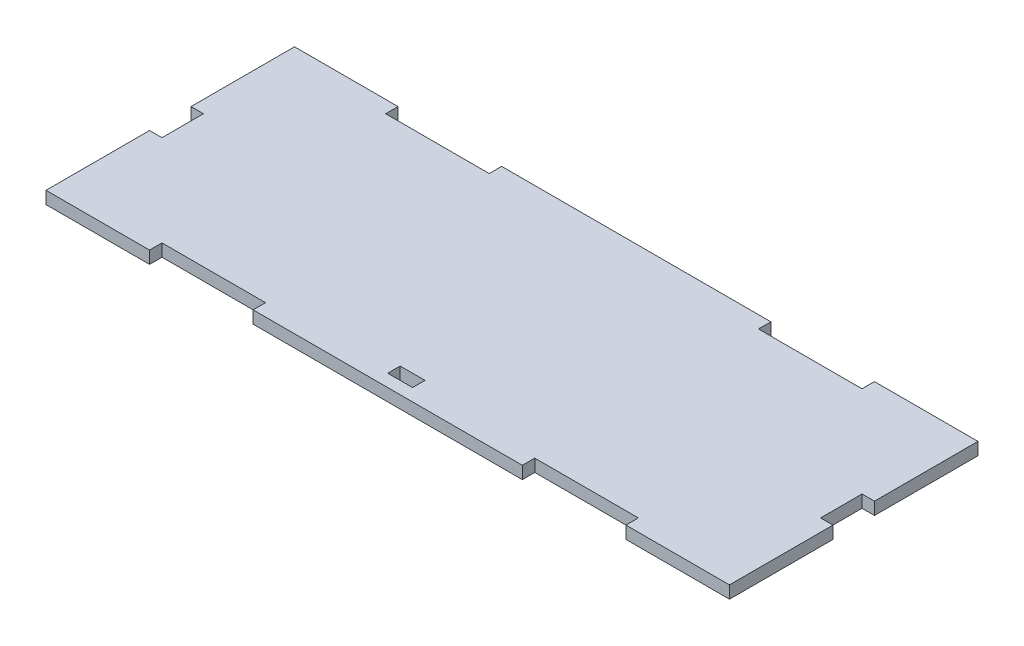
ISO-10303-21;
HEADER;
FILE_DESCRIPTION(('STEP AP214'),'2;1');
FILE_NAME('part.step','',(''),(''),'','','');
FILE_SCHEMA(('AUTOMOTIVE_DESIGN { 1 0 10303 214 1 1 1 1 }'));
ENDSEC;
DATA;
#1=APPLICATION_CONTEXT('core data for automotive mechanical design processes');
#2=APPLICATION_PROTOCOL_DEFINITION('international standard','automotive_design',2000,#1);
#3=PRODUCT_CONTEXT('',#1,'mechanical');
#4=PRODUCT('Part','Part','',(#3));
#5=PRODUCT_RELATED_PRODUCT_CATEGORY('part','',(#4));
#6=PRODUCT_DEFINITION_FORMATION('','',#4);
#7=PRODUCT_DEFINITION_CONTEXT('part definition',#1,'design');
#8=PRODUCT_DEFINITION('design','',#6,#7);
#9=PRODUCT_DEFINITION_SHAPE('','',#8);
#10=(LENGTH_UNIT() NAMED_UNIT(*) SI_UNIT(.MILLI.,.METRE.));
#11=(NAMED_UNIT(*) PLANE_ANGLE_UNIT() SI_UNIT($,.RADIAN.));
#12=(NAMED_UNIT(*) SI_UNIT($,.STERADIAN.) SOLID_ANGLE_UNIT());
#13=UNCERTAINTY_MEASURE_WITH_UNIT(LENGTH_MEASURE(1.E-05),#10,'distance_accuracy_value','');
#14=(GEOMETRIC_REPRESENTATION_CONTEXT(3) GLOBAL_UNCERTAINTY_ASSIGNED_CONTEXT((#13)) GLOBAL_UNIT_ASSIGNED_CONTEXT((#10,
#11,#12)) REPRESENTATION_CONTEXT('',''));
#15=CARTESIAN_POINT('',(0.,0.,0.));
#16=DIRECTION('',(0.,0.,1.));
#17=DIRECTION('',(1.,0.,0.));
#18=AXIS2_PLACEMENT_3D('',#15,#16,#17);
#19=CARTESIAN_POINT('',(0.,3.,0.));
#20=DIRECTION('',(0.,1.,0.));
#21=DIRECTION('',(0.,0.,1.));
#22=AXIS2_PLACEMENT_3D('',#19,#20,#21);
#23=PLANE('',#22);
#24=DIRECTION('',(0.,0.,1.));
#25=VECTOR('',#24,1.);
#26=CARTESIAN_POINT('',(-82.5,3.,-5.));
#27=LINE('',#26,#25);
#28=CARTESIAN_POINT('',(-82.5,3.,-30.));
#29=VERTEX_POINT('',#28);
#30=CARTESIAN_POINT('',(-82.5,3.,-5.));
#31=VERTEX_POINT('',#30);
#32=EDGE_CURVE('E280',#29,#31,#27,.T.);
#33=ORIENTED_EDGE('',*,*,#32,.T.);
#34=DIRECTION('',(1.,0.,0.));
#35=VECTOR('',#34,1.);
#36=CARTESIAN_POINT('',(-82.5,3.,-5.));
#37=LINE('',#36,#35);
#38=CARTESIAN_POINT('',(-79.5,3.,-5.));
#39=VERTEX_POINT('',#38);
#40=EDGE_CURVE('E283',#31,#39,#37,.T.);
#41=ORIENTED_EDGE('',*,*,#40,.T.);
#42=DIRECTION('',(0.,0.,1.));
#43=VECTOR('',#42,1.);
#44=CARTESIAN_POINT('',(-79.5,3.,-5.));
#45=LINE('',#44,#43);
#46=CARTESIAN_POINT('',(-79.5,3.,5.));
#47=VERTEX_POINT('',#46);
#48=EDGE_CURVE('E286',#39,#47,#45,.T.);
#49=ORIENTED_EDGE('',*,*,#48,.T.);
#50=DIRECTION('',(-1.,0.,0.));
#51=VECTOR('',#50,1.);
#52=CARTESIAN_POINT('',(-82.5,3.,5.));
#53=LINE('',#52,#51);
#54=CARTESIAN_POINT('',(-82.5,3.,5.));
#55=VERTEX_POINT('',#54);
#56=EDGE_CURVE('E288',#47,#55,#53,.T.);
#57=ORIENTED_EDGE('',*,*,#56,.T.);
#58=DIRECTION('',(0.,0.,1.));
#59=VECTOR('',#58,1.);
#60=CARTESIAN_POINT('',(-82.5,3.,30.));
#61=LINE('',#60,#59);
#62=CARTESIAN_POINT('',(-82.5,3.,30.));
#63=VERTEX_POINT('',#62);
#64=EDGE_CURVE('E290',#55,#63,#61,.T.);
#65=ORIENTED_EDGE('',*,*,#64,.T.);
#66=DIRECTION('',(1.,0.,0.));
#67=VECTOR('',#66,1.);
#68=CARTESIAN_POINT('',(-57.5,3.,30.));
#69=LINE('',#68,#67);
#70=CARTESIAN_POINT('',(-57.5,3.,30.));
#71=VERTEX_POINT('',#70);
#72=EDGE_CURVE('E292',#63,#71,#69,.T.);
#73=ORIENTED_EDGE('',*,*,#72,.T.);
#74=DIRECTION('',(0.,0.,-1.));
#75=VECTOR('',#74,1.);
#76=CARTESIAN_POINT('',(-57.5,3.,30.));
#77=LINE('',#76,#75);
#78=CARTESIAN_POINT('',(-57.5,3.,27.));
#79=VERTEX_POINT('',#78);
#80=EDGE_CURVE('E294',#71,#79,#77,.T.);
#81=ORIENTED_EDGE('',*,*,#80,.T.);
#82=DIRECTION('',(1.,0.,0.));
#83=VECTOR('',#82,1.);
#84=CARTESIAN_POINT('',(-57.5,3.,27.));
#85=LINE('',#84,#83);
#86=CARTESIAN_POINT('',(-32.5,3.,27.));
#87=VERTEX_POINT('',#86);
#88=EDGE_CURVE('E296',#79,#87,#85,.T.);
#89=ORIENTED_EDGE('',*,*,#88,.T.);
#90=DIRECTION('',(0.,0.,1.));
#91=VECTOR('',#90,1.);
#92=CARTESIAN_POINT('',(-32.5,3.,30.));
#93=LINE('',#92,#91);
#94=CARTESIAN_POINT('',(-32.5,3.,30.));
#95=VERTEX_POINT('',#94);
#96=EDGE_CURVE('E298',#87,#95,#93,.T.);
#97=ORIENTED_EDGE('',*,*,#96,.T.);
#98=DIRECTION('',(1.,0.,0.));
#99=VECTOR('',#98,1.);
#100=CARTESIAN_POINT('',(32.5,3.,30.));
#101=LINE('',#100,#99);
#102=CARTESIAN_POINT('',(32.5,3.,30.));
#103=VERTEX_POINT('',#102);
#104=EDGE_CURVE('E300',#95,#103,#101,.T.);
#105=ORIENTED_EDGE('',*,*,#104,.T.);
#106=DIRECTION('',(0.,0.,-1.));
#107=VECTOR('',#106,1.);
#108=CARTESIAN_POINT('',(32.5,3.,30.));
#109=LINE('',#108,#107);
#110=CARTESIAN_POINT('',(32.5,3.,27.));
#111=VERTEX_POINT('',#110);
#112=EDGE_CURVE('E302',#103,#111,#109,.T.);
#113=ORIENTED_EDGE('',*,*,#112,.T.);
#114=DIRECTION('',(1.,0.,0.));
#115=VECTOR('',#114,1.);
#116=CARTESIAN_POINT('',(32.5,3.,27.));
#117=LINE('',#116,#115);
#118=CARTESIAN_POINT('',(57.5,3.,27.));
#119=VERTEX_POINT('',#118);
#120=EDGE_CURVE('E304',#111,#119,#117,.T.);
#121=ORIENTED_EDGE('',*,*,#120,.T.);
#122=DIRECTION('',(0.,0.,1.));
#123=VECTOR('',#122,1.);
#124=CARTESIAN_POINT('',(57.5,3.,30.));
#125=LINE('',#124,#123);
#126=CARTESIAN_POINT('',(57.5,3.,30.));
#127=VERTEX_POINT('',#126);
#128=EDGE_CURVE('E306',#119,#127,#125,.T.);
#129=ORIENTED_EDGE('',*,*,#128,.T.);
#130=DIRECTION('',(1.,0.,0.));
#131=VECTOR('',#130,1.);
#132=CARTESIAN_POINT('',(82.5,3.,30.));
#133=LINE('',#132,#131);
#134=CARTESIAN_POINT('',(82.5,3.,30.));
#135=VERTEX_POINT('',#134);
#136=EDGE_CURVE('E308',#127,#135,#133,.T.);
#137=ORIENTED_EDGE('',*,*,#136,.T.);
#138=DIRECTION('',(0.,0.,-1.));
#139=VECTOR('',#138,1.);
#140=CARTESIAN_POINT('',(82.5,3.,30.));
#141=LINE('',#140,#139);
#142=CARTESIAN_POINT('',(82.5,3.,5.));
#143=VERTEX_POINT('',#142);
#144=EDGE_CURVE('E310',#135,#143,#141,.T.);
#145=ORIENTED_EDGE('',*,*,#144,.T.);
#146=DIRECTION('',(-1.,0.,0.));
#147=VECTOR('',#146,1.);
#148=CARTESIAN_POINT('',(82.5,3.,5.));
#149=LINE('',#148,#147);
#150=CARTESIAN_POINT('',(79.5,3.,5.));
#151=VERTEX_POINT('',#150);
#152=EDGE_CURVE('E312',#143,#151,#149,.T.);
#153=ORIENTED_EDGE('',*,*,#152,.T.);
#154=DIRECTION('',(0.,0.,-1.));
#155=VECTOR('',#154,1.);
#156=CARTESIAN_POINT('',(79.5,3.,-5.));
#157=LINE('',#156,#155);
#158=CARTESIAN_POINT('',(79.5,3.,-5.));
#159=VERTEX_POINT('',#158);
#160=EDGE_CURVE('E314',#151,#159,#157,.T.);
#161=ORIENTED_EDGE('',*,*,#160,.T.);
#162=DIRECTION('',(1.,0.,0.));
#163=VECTOR('',#162,1.);
#164=CARTESIAN_POINT('',(82.5,3.,-5.));
#165=LINE('',#164,#163);
#166=CARTESIAN_POINT('',(82.5,3.,-5.));
#167=VERTEX_POINT('',#166);
#168=EDGE_CURVE('E316',#159,#167,#165,.T.);
#169=ORIENTED_EDGE('',*,*,#168,.T.);
#170=DIRECTION('',(0.,0.,-1.));
#171=VECTOR('',#170,1.);
#172=CARTESIAN_POINT('',(82.5,3.,-5.));
#173=LINE('',#172,#171);
#174=CARTESIAN_POINT('',(82.5,3.,-30.));
#175=VERTEX_POINT('',#174);
#176=EDGE_CURVE('E318',#167,#175,#173,.T.);
#177=ORIENTED_EDGE('',*,*,#176,.T.);
#178=DIRECTION('',(-1.,0.,0.));
#179=VECTOR('',#178,1.);
#180=CARTESIAN_POINT('',(82.5,3.,-30.));
#181=LINE('',#180,#179);
#182=CARTESIAN_POINT('',(57.5,3.,-30.));
#183=VERTEX_POINT('',#182);
#184=EDGE_CURVE('E320',#175,#183,#181,.T.);
#185=ORIENTED_EDGE('',*,*,#184,.T.);
#186=DIRECTION('',(0.,0.,1.));
#187=VECTOR('',#186,1.);
#188=CARTESIAN_POINT('',(57.5,3.,-30.));
#189=LINE('',#188,#187);
#190=CARTESIAN_POINT('',(57.5,3.,-27.));
#191=VERTEX_POINT('',#190);
#192=EDGE_CURVE('E322',#183,#191,#189,.T.);
#193=ORIENTED_EDGE('',*,*,#192,.T.);
#194=DIRECTION('',(-1.,0.,0.));
#195=VECTOR('',#194,1.);
#196=CARTESIAN_POINT('',(32.5,3.,-27.));
#197=LINE('',#196,#195);
#198=CARTESIAN_POINT('',(32.5,3.,-27.));
#199=VERTEX_POINT('',#198);
#200=EDGE_CURVE('E324',#191,#199,#197,.T.);
#201=ORIENTED_EDGE('',*,*,#200,.T.);
#202=DIRECTION('',(0.,0.,-1.));
#203=VECTOR('',#202,1.);
#204=CARTESIAN_POINT('',(32.5,3.,-30.));
#205=LINE('',#204,#203);
#206=CARTESIAN_POINT('',(32.5,3.,-30.));
#207=VERTEX_POINT('',#206);
#208=EDGE_CURVE('E326',#199,#207,#205,.T.);
#209=ORIENTED_EDGE('',*,*,#208,.T.);
#210=DIRECTION('',(-1.,0.,0.));
#211=VECTOR('',#210,1.);
#212=CARTESIAN_POINT('',(32.5,3.,-30.));
#213=LINE('',#212,#211);
#214=CARTESIAN_POINT('',(-32.5,3.,-30.));
#215=VERTEX_POINT('',#214);
#216=EDGE_CURVE('E328',#207,#215,#213,.T.);
#217=ORIENTED_EDGE('',*,*,#216,.T.);
#218=DIRECTION('',(0.,0.,1.));
#219=VECTOR('',#218,1.);
#220=CARTESIAN_POINT('',(-32.5,3.,-30.));
#221=LINE('',#220,#219);
#222=CARTESIAN_POINT('',(-32.5,3.,-27.));
#223=VERTEX_POINT('',#222);
#224=EDGE_CURVE('E330',#215,#223,#221,.T.);
#225=ORIENTED_EDGE('',*,*,#224,.T.);
#226=DIRECTION('',(-1.,0.,0.));
#227=VECTOR('',#226,1.);
#228=CARTESIAN_POINT('',(-57.5,3.,-27.));
#229=LINE('',#228,#227);
#230=CARTESIAN_POINT('',(-57.5,3.,-27.));
#231=VERTEX_POINT('',#230);
#232=EDGE_CURVE('E332',#223,#231,#229,.T.);
#233=ORIENTED_EDGE('',*,*,#232,.T.);
#234=DIRECTION('',(0.,0.,-1.));
#235=VECTOR('',#234,1.);
#236=CARTESIAN_POINT('',(-57.5,3.,-30.));
#237=LINE('',#236,#235);
#238=CARTESIAN_POINT('',(-57.5,3.,-30.));
#239=VERTEX_POINT('',#238);
#240=EDGE_CURVE('E334',#231,#239,#237,.T.);
#241=ORIENTED_EDGE('',*,*,#240,.T.);
#242=DIRECTION('',(-1.,0.,0.));
#243=VECTOR('',#242,1.);
#244=CARTESIAN_POINT('',(-57.5,3.,-30.));
#245=LINE('',#244,#243);
#246=EDGE_CURVE('E336',#239,#29,#245,.T.);
#247=ORIENTED_EDGE('',*,*,#246,.T.);
#248=EDGE_LOOP('',(#33,#41,#49,#57,#65,#73,#81,#89,#97,#105,#113,#121,#129,#137,#145,#153,#161,
#169,#177,#185,#193,#201,#209,#217,#225,#233,#241,#247));
#249=FACE_BOUND('',#248,.T.);
#250=DIRECTION('',(-1.,0.,0.));
#251=VECTOR('',#250,1.);
#252=CARTESIAN_POINT('',(-3.,3.,24.));
#253=LINE('',#252,#251);
#254=CARTESIAN_POINT('',(3.,3.,24.));
#255=VERTEX_POINT('',#254);
#256=CARTESIAN_POINT('',(-3.,3.,24.));
#257=VERTEX_POINT('',#256);
#258=EDGE_CURVE('E252',#255,#257,#253,.T.);
#259=ORIENTED_EDGE('',*,*,#258,.F.);
#260=DIRECTION('',(0.,0.,-1.));
#261=VECTOR('',#260,1.);
#262=CARTESIAN_POINT('',(3.,3.,24.));
#263=LINE('',#262,#261);
#264=CARTESIAN_POINT('',(3.,3.,27.));
#265=VERTEX_POINT('',#264);
#266=EDGE_CURVE('E244',#265,#255,#263,.T.);
#267=ORIENTED_EDGE('',*,*,#266,.F.);
#268=DIRECTION('',(1.,0.,0.));
#269=VECTOR('',#268,1.);
#270=CARTESIAN_POINT('',(-3.,3.,27.));
#271=LINE('',#270,#269);
#272=CARTESIAN_POINT('',(-3.,3.,27.));
#273=VERTEX_POINT('',#272);
#274=EDGE_CURVE('E266',#273,#265,#271,.T.);
#275=ORIENTED_EDGE('',*,*,#274,.F.);
#276=DIRECTION('',(0.,0.,1.));
#277=VECTOR('',#276,1.);
#278=CARTESIAN_POINT('',(-3.,3.,24.));
#279=LINE('',#278,#277);
#280=EDGE_CURVE('E264',#257,#273,#279,.T.);
#281=ORIENTED_EDGE('',*,*,#280,.F.);
#282=EDGE_LOOP('',(#259,#267,#275,#281));
#283=FACE_BOUND('',#282,.T.);
#284=ADVANCED_FACE('F35',(#249,#283),#23,.T.);
#285=CARTESIAN_POINT('',(0.,0.,0.));
#286=DIRECTION('',(0.,1.,0.));
#287=DIRECTION('',(0.,0.,1.));
#288=AXIS2_PLACEMENT_3D('',#285,#286,#287);
#289=PLANE('',#288);
#290=DIRECTION('',(0.,0.,1.));
#291=VECTOR('',#290,1.);
#292=CARTESIAN_POINT('',(-82.5,0.,-5.));
#293=LINE('',#292,#291);
#294=CARTESIAN_POINT('',(-82.5,0.,-30.));
#295=VERTEX_POINT('',#294);
#296=CARTESIAN_POINT('',(-82.5,0.,-5.));
#297=VERTEX_POINT('',#296);
#298=EDGE_CURVE('E260',#295,#297,#293,.T.);
#299=ORIENTED_EDGE('',*,*,#298,.F.);
#300=DIRECTION('',(-1.,0.,0.));
#301=VECTOR('',#300,1.);
#302=CARTESIAN_POINT('',(-57.5,0.,-30.));
#303=LINE('',#302,#301);
#304=CARTESIAN_POINT('',(-57.5,0.,-30.));
#305=VERTEX_POINT('',#304);
#306=EDGE_CURVE('E284',#305,#295,#303,.T.);
#307=ORIENTED_EDGE('',*,*,#306,.F.);
#308=DIRECTION('',(0.,0.,-1.));
#309=VECTOR('',#308,1.);
#310=CARTESIAN_POINT('',(-57.5,0.,-30.));
#311=LINE('',#310,#309);
#312=CARTESIAN_POINT('',(-57.5,0.,-27.));
#313=VERTEX_POINT('',#312);
#314=EDGE_CURVE('E391',#313,#305,#311,.T.);
#315=ORIENTED_EDGE('',*,*,#314,.F.);
#316=DIRECTION('',(-1.,0.,0.));
#317=VECTOR('',#316,1.);
#318=CARTESIAN_POINT('',(-57.5,0.,-27.));
#319=LINE('',#318,#317);
#320=CARTESIAN_POINT('',(-32.5,0.,-27.));
#321=VERTEX_POINT('',#320);
#322=EDGE_CURVE('E389',#321,#313,#319,.T.);
#323=ORIENTED_EDGE('',*,*,#322,.F.);
#324=DIRECTION('',(0.,0.,1.));
#325=VECTOR('',#324,1.);
#326=CARTESIAN_POINT('',(-32.5,0.,-30.));
#327=LINE('',#326,#325);
#328=CARTESIAN_POINT('',(-32.5,0.,-30.));
#329=VERTEX_POINT('',#328);
#330=EDGE_CURVE('E387',#329,#321,#327,.T.);
#331=ORIENTED_EDGE('',*,*,#330,.F.);
#332=DIRECTION('',(-1.,0.,0.));
#333=VECTOR('',#332,1.);
#334=CARTESIAN_POINT('',(32.5,0.,-30.));
#335=LINE('',#334,#333);
#336=CARTESIAN_POINT('',(32.5,0.,-30.));
#337=VERTEX_POINT('',#336);
#338=EDGE_CURVE('E385',#337,#329,#335,.T.);
#339=ORIENTED_EDGE('',*,*,#338,.F.);
#340=DIRECTION('',(0.,0.,-1.));
#341=VECTOR('',#340,1.);
#342=CARTESIAN_POINT('',(32.5,0.,-30.));
#343=LINE('',#342,#341);
#344=CARTESIAN_POINT('',(32.5,0.,-27.));
#345=VERTEX_POINT('',#344);
#346=EDGE_CURVE('E383',#345,#337,#343,.T.);
#347=ORIENTED_EDGE('',*,*,#346,.F.);
#348=DIRECTION('',(-1.,0.,0.));
#349=VECTOR('',#348,1.);
#350=CARTESIAN_POINT('',(32.5,0.,-27.));
#351=LINE('',#350,#349);
#352=CARTESIAN_POINT('',(57.5,0.,-27.));
#353=VERTEX_POINT('',#352);
#354=EDGE_CURVE('E381',#353,#345,#351,.T.);
#355=ORIENTED_EDGE('',*,*,#354,.F.);
#356=DIRECTION('',(0.,0.,1.));
#357=VECTOR('',#356,1.);
#358=CARTESIAN_POINT('',(57.5,0.,-30.));
#359=LINE('',#358,#357);
#360=CARTESIAN_POINT('',(57.5,0.,-30.));
#361=VERTEX_POINT('',#360);
#362=EDGE_CURVE('E379',#361,#353,#359,.T.);
#363=ORIENTED_EDGE('',*,*,#362,.F.);
#364=DIRECTION('',(-1.,0.,0.));
#365=VECTOR('',#364,1.);
#366=CARTESIAN_POINT('',(82.5,0.,-30.));
#367=LINE('',#366,#365);
#368=CARTESIAN_POINT('',(82.5,0.,-30.));
#369=VERTEX_POINT('',#368);
#370=EDGE_CURVE('E377',#369,#361,#367,.T.);
#371=ORIENTED_EDGE('',*,*,#370,.F.);
#372=DIRECTION('',(0.,0.,-1.));
#373=VECTOR('',#372,1.);
#374=CARTESIAN_POINT('',(82.5,0.,-5.));
#375=LINE('',#374,#373);
#376=CARTESIAN_POINT('',(82.5,0.,-5.));
#377=VERTEX_POINT('',#376);
#378=EDGE_CURVE('E375',#377,#369,#375,.T.);
#379=ORIENTED_EDGE('',*,*,#378,.F.);
#380=DIRECTION('',(1.,0.,0.));
#381=VECTOR('',#380,1.);
#382=CARTESIAN_POINT('',(82.5,0.,-5.));
#383=LINE('',#382,#381);
#384=CARTESIAN_POINT('',(79.5,0.,-5.));
#385=VERTEX_POINT('',#384);
#386=EDGE_CURVE('E373',#385,#377,#383,.T.);
#387=ORIENTED_EDGE('',*,*,#386,.F.);
#388=DIRECTION('',(0.,0.,-1.));
#389=VECTOR('',#388,1.);
#390=CARTESIAN_POINT('',(79.5,0.,-5.));
#391=LINE('',#390,#389);
#392=CARTESIAN_POINT('',(79.5,0.,5.));
#393=VERTEX_POINT('',#392);
#394=EDGE_CURVE('E371',#393,#385,#391,.T.);
#395=ORIENTED_EDGE('',*,*,#394,.F.);
#396=DIRECTION('',(-1.,0.,0.));
#397=VECTOR('',#396,1.);
#398=CARTESIAN_POINT('',(82.5,0.,5.));
#399=LINE('',#398,#397);
#400=CARTESIAN_POINT('',(82.5,0.,5.));
#401=VERTEX_POINT('',#400);
#402=EDGE_CURVE('E369',#401,#393,#399,.T.);
#403=ORIENTED_EDGE('',*,*,#402,.F.);
#404=DIRECTION('',(0.,0.,-1.));
#405=VECTOR('',#404,1.);
#406=CARTESIAN_POINT('',(82.5,0.,30.));
#407=LINE('',#406,#405);
#408=CARTESIAN_POINT('',(82.5,0.,30.));
#409=VERTEX_POINT('',#408);
#410=EDGE_CURVE('E367',#409,#401,#407,.T.);
#411=ORIENTED_EDGE('',*,*,#410,.F.);
#412=DIRECTION('',(1.,0.,0.));
#413=VECTOR('',#412,1.);
#414=CARTESIAN_POINT('',(82.5,0.,30.));
#415=LINE('',#414,#413);
#416=CARTESIAN_POINT('',(57.5,0.,30.));
#417=VERTEX_POINT('',#416);
#418=EDGE_CURVE('E365',#417,#409,#415,.T.);
#419=ORIENTED_EDGE('',*,*,#418,.F.);
#420=DIRECTION('',(0.,0.,1.));
#421=VECTOR('',#420,1.);
#422=CARTESIAN_POINT('',(57.5,0.,30.));
#423=LINE('',#422,#421);
#424=CARTESIAN_POINT('',(57.5,0.,27.));
#425=VERTEX_POINT('',#424);
#426=EDGE_CURVE('E363',#425,#417,#423,.T.);
#427=ORIENTED_EDGE('',*,*,#426,.F.);
#428=DIRECTION('',(1.,0.,0.));
#429=VECTOR('',#428,1.);
#430=CARTESIAN_POINT('',(32.5,0.,27.));
#431=LINE('',#430,#429);
#432=CARTESIAN_POINT('',(32.5,0.,27.));
#433=VERTEX_POINT('',#432);
#434=EDGE_CURVE('E361',#433,#425,#431,.T.);
#435=ORIENTED_EDGE('',*,*,#434,.F.);
#436=DIRECTION('',(0.,0.,-1.));
#437=VECTOR('',#436,1.);
#438=CARTESIAN_POINT('',(32.5,0.,30.));
#439=LINE('',#438,#437);
#440=CARTESIAN_POINT('',(32.5,0.,30.));
#441=VERTEX_POINT('',#440);
#442=EDGE_CURVE('E359',#441,#433,#439,.T.);
#443=ORIENTED_EDGE('',*,*,#442,.F.);
#444=DIRECTION('',(1.,0.,0.));
#445=VECTOR('',#444,1.);
#446=CARTESIAN_POINT('',(32.5,0.,30.));
#447=LINE('',#446,#445);
#448=CARTESIAN_POINT('',(-32.5,0.,30.));
#449=VERTEX_POINT('',#448);
#450=EDGE_CURVE('E357',#449,#441,#447,.T.);
#451=ORIENTED_EDGE('',*,*,#450,.F.);
#452=DIRECTION('',(0.,0.,1.));
#453=VECTOR('',#452,1.);
#454=CARTESIAN_POINT('',(-32.5,0.,30.));
#455=LINE('',#454,#453);
#456=CARTESIAN_POINT('',(-32.5,0.,27.));
#457=VERTEX_POINT('',#456);
#458=EDGE_CURVE('E355',#457,#449,#455,.T.);
#459=ORIENTED_EDGE('',*,*,#458,.F.);
#460=DIRECTION('',(1.,0.,0.));
#461=VECTOR('',#460,1.);
#462=CARTESIAN_POINT('',(-57.5,0.,27.));
#463=LINE('',#462,#461);
#464=CARTESIAN_POINT('',(-57.5,0.,27.));
#465=VERTEX_POINT('',#464);
#466=EDGE_CURVE('E353',#465,#457,#463,.T.);
#467=ORIENTED_EDGE('',*,*,#466,.F.);
#468=DIRECTION('',(0.,0.,-1.));
#469=VECTOR('',#468,1.);
#470=CARTESIAN_POINT('',(-57.5,0.,30.));
#471=LINE('',#470,#469);
#472=CARTESIAN_POINT('',(-57.5,0.,30.));
#473=VERTEX_POINT('',#472);
#474=EDGE_CURVE('E351',#473,#465,#471,.T.);
#475=ORIENTED_EDGE('',*,*,#474,.F.);
#476=DIRECTION('',(1.,0.,0.));
#477=VECTOR('',#476,1.);
#478=CARTESIAN_POINT('',(-57.5,0.,30.));
#479=LINE('',#478,#477);
#480=CARTESIAN_POINT('',(-82.5,0.,30.));
#481=VERTEX_POINT('',#480);
#482=EDGE_CURVE('E349',#481,#473,#479,.T.);
#483=ORIENTED_EDGE('',*,*,#482,.F.);
#484=DIRECTION('',(0.,0.,1.));
#485=VECTOR('',#484,1.);
#486=CARTESIAN_POINT('',(-82.5,0.,30.));
#487=LINE('',#486,#485);
#488=CARTESIAN_POINT('',(-82.5,0.,5.));
#489=VERTEX_POINT('',#488);
#490=EDGE_CURVE('E347',#489,#481,#487,.T.);
#491=ORIENTED_EDGE('',*,*,#490,.F.);
#492=DIRECTION('',(-1.,0.,0.));
#493=VECTOR('',#492,1.);
#494=CARTESIAN_POINT('',(-82.5,0.,5.));
#495=LINE('',#494,#493);
#496=CARTESIAN_POINT('',(-79.5,0.,5.));
#497=VERTEX_POINT('',#496);
#498=EDGE_CURVE('E345',#497,#489,#495,.T.);
#499=ORIENTED_EDGE('',*,*,#498,.F.);
#500=DIRECTION('',(0.,0.,1.));
#501=VECTOR('',#500,1.);
#502=CARTESIAN_POINT('',(-79.5,0.,-5.));
#503=LINE('',#502,#501);
#504=CARTESIAN_POINT('',(-79.5,0.,-5.));
#505=VERTEX_POINT('',#504);
#506=EDGE_CURVE('E343',#505,#497,#503,.T.);
#507=ORIENTED_EDGE('',*,*,#506,.F.);
#508=DIRECTION('',(1.,0.,0.));
#509=VECTOR('',#508,1.);
#510=CARTESIAN_POINT('',(-82.5,0.,-5.));
#511=LINE('',#510,#509);
#512=EDGE_CURVE('E341',#297,#505,#511,.T.);
#513=ORIENTED_EDGE('',*,*,#512,.F.);
#514=EDGE_LOOP('',(#299,#307,#315,#323,#331,#339,#347,#355,#363,#371,#379,#387,#395,#403,#411,
#419,#427,#435,#443,#451,#459,#467,#475,#483,#491,#499,#507,#513));
#515=FACE_BOUND('',#514,.T.);
#516=DIRECTION('',(0.,0.,-1.));
#517=VECTOR('',#516,1.);
#518=CARTESIAN_POINT('',(3.,0.,24.));
#519=LINE('',#518,#517);
#520=CARTESIAN_POINT('',(3.,0.,27.));
#521=VERTEX_POINT('',#520);
#522=CARTESIAN_POINT('',(3.,0.,24.));
#523=VERTEX_POINT('',#522);
#524=EDGE_CURVE('E58',#521,#523,#519,.T.);
#525=ORIENTED_EDGE('',*,*,#524,.T.);
#526=DIRECTION('',(-1.,0.,0.));
#527=VECTOR('',#526,1.);
#528=CARTESIAN_POINT('',(-3.,0.,24.));
#529=LINE('',#528,#527);
#530=CARTESIAN_POINT('',(-3.,0.,24.));
#531=VERTEX_POINT('',#530);
#532=EDGE_CURVE('E259',#523,#531,#529,.T.);
#533=ORIENTED_EDGE('',*,*,#532,.T.);
#534=DIRECTION('',(0.,0.,1.));
#535=VECTOR('',#534,1.);
#536=CARTESIAN_POINT('',(-3.,0.,24.));
#537=LINE('',#536,#535);
#538=CARTESIAN_POINT('',(-3.,0.,27.));
#539=VERTEX_POINT('',#538);
#540=EDGE_CURVE('E272',#531,#539,#537,.T.);
#541=ORIENTED_EDGE('',*,*,#540,.T.);
#542=DIRECTION('',(1.,0.,0.));
#543=VECTOR('',#542,1.);
#544=CARTESIAN_POINT('',(-3.,0.,27.));
#545=LINE('',#544,#543);
#546=EDGE_CURVE('E253',#539,#521,#545,.T.);
#547=ORIENTED_EDGE('',*,*,#546,.T.);
#548=EDGE_LOOP('',(#525,#533,#541,#547));
#549=FACE_BOUND('',#548,.T.);
#550=ADVANCED_FACE('F481',(#515,#549),#289,.F.);
#551=CARTESIAN_POINT('',(-82.5,3.,-5.));
#552=DIRECTION('',(1.,0.,0.));
#553=DIRECTION('',(0.,0.,-1.));
#554=AXIS2_PLACEMENT_3D('',#551,#552,#553);
#555=PLANE('',#554);
#556=ORIENTED_EDGE('',*,*,#298,.T.);
#557=DIRECTION('',(0.,-1.,0.));
#558=VECTOR('',#557,1.);
#559=CARTESIAN_POINT('',(-82.5,3.,-5.));
#560=LINE('',#559,#558);
#561=EDGE_CURVE('E11',#31,#297,#560,.T.);
#562=ORIENTED_EDGE('',*,*,#561,.F.);
#563=ORIENTED_EDGE('',*,*,#32,.F.);
#564=DIRECTION('',(0.,-1.,0.));
#565=VECTOR('',#564,1.);
#566=CARTESIAN_POINT('',(-82.5,3.,-30.));
#567=LINE('',#566,#565);
#568=EDGE_CURVE('E338',#29,#295,#567,.T.);
#569=ORIENTED_EDGE('',*,*,#568,.T.);
#570=EDGE_LOOP('',(#556,#562,#563,#569));
#571=FACE_BOUND('',#570,.T.);
#572=ADVANCED_FACE('F37',(#571),#555,.F.);
#573=CARTESIAN_POINT('',(-82.5,3.,-5.));
#574=DIRECTION('',(0.,0.,-1.));
#575=DIRECTION('',(-1.,0.,0.));
#576=AXIS2_PLACEMENT_3D('',#573,#574,#575);
#577=PLANE('',#576);
#578=ORIENTED_EDGE('',*,*,#512,.T.);
#579=DIRECTION('',(0.,-1.,0.));
#580=VECTOR('',#579,1.);
#581=CARTESIAN_POINT('',(-79.5,3.,-5.));
#582=LINE('',#581,#580);
#583=EDGE_CURVE('E43',#39,#505,#582,.T.);
#584=ORIENTED_EDGE('',*,*,#583,.F.);
#585=ORIENTED_EDGE('',*,*,#40,.F.);
#586=ORIENTED_EDGE('',*,*,#561,.T.);
#587=EDGE_LOOP('',(#578,#584,#585,#586));
#588=FACE_BOUND('',#587,.T.);
#589=ADVANCED_FACE('F498',(#588),#577,.F.);
#590=CARTESIAN_POINT('',(-79.5,3.,-5.));
#591=DIRECTION('',(1.,0.,0.));
#592=DIRECTION('',(0.,0.,-1.));
#593=AXIS2_PLACEMENT_3D('',#590,#591,#592);
#594=PLANE('',#593);
#595=ORIENTED_EDGE('',*,*,#506,.T.);
#596=DIRECTION('',(0.,-1.,0.));
#597=VECTOR('',#596,1.);
#598=CARTESIAN_POINT('',(-79.5,3.,5.));
#599=LINE('',#598,#597);
#600=EDGE_CURVE('E468',#47,#497,#599,.T.);
#601=ORIENTED_EDGE('',*,*,#600,.F.);
#602=ORIENTED_EDGE('',*,*,#48,.F.);
#603=ORIENTED_EDGE('',*,*,#583,.T.);
#604=EDGE_LOOP('',(#595,#601,#602,#603));
#605=FACE_BOUND('',#604,.T.);
#606=ADVANCED_FACE('F475',(#605),#594,.F.);
#607=CARTESIAN_POINT('',(-82.5,3.,5.));
#608=DIRECTION('',(0.,0.,1.));
#609=DIRECTION('',(1.,0.,0.));
#610=AXIS2_PLACEMENT_3D('',#607,#608,#609);
#611=PLANE('',#610);
#612=ORIENTED_EDGE('',*,*,#498,.T.);
#613=DIRECTION('',(0.,-1.,0.));
#614=VECTOR('',#613,1.);
#615=CARTESIAN_POINT('',(-82.5,3.,5.));
#616=LINE('',#615,#614);
#617=EDGE_CURVE('E465',#55,#489,#616,.T.);
#618=ORIENTED_EDGE('',*,*,#617,.F.);
#619=ORIENTED_EDGE('',*,*,#56,.F.);
#620=ORIENTED_EDGE('',*,*,#600,.T.);
#621=EDGE_LOOP('',(#612,#618,#619,#620));
#622=FACE_BOUND('',#621,.T.);
#623=ADVANCED_FACE('F487',(#622),#611,.F.);
#624=CARTESIAN_POINT('',(-82.5,3.,30.));
#625=DIRECTION('',(1.,0.,0.));
#626=DIRECTION('',(0.,0.,-1.));
#627=AXIS2_PLACEMENT_3D('',#624,#625,#626);
#628=PLANE('',#627);
#629=ORIENTED_EDGE('',*,*,#490,.T.);
#630=DIRECTION('',(0.,-1.,0.));
#631=VECTOR('',#630,1.);
#632=CARTESIAN_POINT('',(-82.5,3.,30.));
#633=LINE('',#632,#631);
#634=EDGE_CURVE('E462',#63,#481,#633,.T.);
#635=ORIENTED_EDGE('',*,*,#634,.F.);
#636=ORIENTED_EDGE('',*,*,#64,.F.);
#637=ORIENTED_EDGE('',*,*,#617,.T.);
#638=EDGE_LOOP('',(#629,#635,#636,#637));
#639=FACE_BOUND('',#638,.T.);
#640=ADVANCED_FACE('F491',(#639),#628,.F.);
#641=CARTESIAN_POINT('',(-57.5,3.,30.));
#642=DIRECTION('',(0.,0.,-1.));
#643=DIRECTION('',(-1.,0.,0.));
#644=AXIS2_PLACEMENT_3D('',#641,#642,#643);
#645=PLANE('',#644);
#646=ORIENTED_EDGE('',*,*,#482,.T.);
#647=DIRECTION('',(0.,-1.,0.));
#648=VECTOR('',#647,1.);
#649=CARTESIAN_POINT('',(-57.5,3.,30.));
#650=LINE('',#649,#648);
#651=EDGE_CURVE('E459',#71,#473,#650,.T.);
#652=ORIENTED_EDGE('',*,*,#651,.F.);
#653=ORIENTED_EDGE('',*,*,#72,.F.);
#654=ORIENTED_EDGE('',*,*,#634,.T.);
#655=EDGE_LOOP('',(#646,#652,#653,#654));
#656=FACE_BOUND('',#655,.T.);
#657=ADVANCED_FACE('F611',(#656),#645,.F.);
#658=CARTESIAN_POINT('',(-57.5,3.,30.));
#659=DIRECTION('',(-1.,0.,0.));
#660=DIRECTION('',(0.,0.,1.));
#661=AXIS2_PLACEMENT_3D('',#658,#659,#660);
#662=PLANE('',#661);
#663=ORIENTED_EDGE('',*,*,#474,.T.);
#664=DIRECTION('',(0.,-1.,0.));
#665=VECTOR('',#664,1.);
#666=CARTESIAN_POINT('',(-57.5,3.,27.));
#667=LINE('',#666,#665);
#668=EDGE_CURVE('E456',#79,#465,#667,.T.);
#669=ORIENTED_EDGE('',*,*,#668,.F.);
#670=ORIENTED_EDGE('',*,*,#80,.F.);
#671=ORIENTED_EDGE('',*,*,#651,.T.);
#672=EDGE_LOOP('',(#663,#669,#670,#671));
#673=FACE_BOUND('',#672,.T.);
#674=ADVANCED_FACE('F608',(#673),#662,.F.);
#675=CARTESIAN_POINT('',(-57.5,3.,27.));
#676=DIRECTION('',(0.,0.,-1.));
#677=DIRECTION('',(-1.,0.,0.));
#678=AXIS2_PLACEMENT_3D('',#675,#676,#677);
#679=PLANE('',#678);
#680=ORIENTED_EDGE('',*,*,#466,.T.);
#681=DIRECTION('',(0.,-1.,0.));
#682=VECTOR('',#681,1.);
#683=CARTESIAN_POINT('',(-32.5,3.,27.));
#684=LINE('',#683,#682);
#685=EDGE_CURVE('E453',#87,#457,#684,.T.);
#686=ORIENTED_EDGE('',*,*,#685,.F.);
#687=ORIENTED_EDGE('',*,*,#88,.F.);
#688=ORIENTED_EDGE('',*,*,#668,.T.);
#689=EDGE_LOOP('',(#680,#686,#687,#688));
#690=FACE_BOUND('',#689,.T.);
#691=ADVANCED_FACE('F604',(#690),#679,.F.);
#692=CARTESIAN_POINT('',(-32.5,3.,30.));
#693=DIRECTION('',(1.,0.,0.));
#694=DIRECTION('',(0.,0.,-1.));
#695=AXIS2_PLACEMENT_3D('',#692,#693,#694);
#696=PLANE('',#695);
#697=ORIENTED_EDGE('',*,*,#458,.T.);
#698=DIRECTION('',(0.,-1.,0.));
#699=VECTOR('',#698,1.);
#700=CARTESIAN_POINT('',(-32.5,3.,30.));
#701=LINE('',#700,#699);
#702=EDGE_CURVE('E450',#95,#449,#701,.T.);
#703=ORIENTED_EDGE('',*,*,#702,.F.);
#704=ORIENTED_EDGE('',*,*,#96,.F.);
#705=ORIENTED_EDGE('',*,*,#685,.T.);
#706=EDGE_LOOP('',(#697,#703,#704,#705));
#707=FACE_BOUND('',#706,.T.);
#708=ADVANCED_FACE('F600',(#707),#696,.F.);
#709=CARTESIAN_POINT('',(32.5,3.,30.));
#710=DIRECTION('',(0.,0.,-1.));
#711=DIRECTION('',(-1.,0.,0.));
#712=AXIS2_PLACEMENT_3D('',#709,#710,#711);
#713=PLANE('',#712);
#714=ORIENTED_EDGE('',*,*,#450,.T.);
#715=DIRECTION('',(0.,-1.,0.));
#716=VECTOR('',#715,1.);
#717=CARTESIAN_POINT('',(32.5,3.,30.));
#718=LINE('',#717,#716);
#719=EDGE_CURVE('E447',#103,#441,#718,.T.);
#720=ORIENTED_EDGE('',*,*,#719,.F.);
#721=ORIENTED_EDGE('',*,*,#104,.F.);
#722=ORIENTED_EDGE('',*,*,#702,.T.);
#723=EDGE_LOOP('',(#714,#720,#721,#722));
#724=FACE_BOUND('',#723,.T.);
#725=ADVANCED_FACE('F595',(#724),#713,.F.);
#726=CARTESIAN_POINT('',(32.5,3.,30.));
#727=DIRECTION('',(-1.,0.,0.));
#728=DIRECTION('',(0.,0.,1.));
#729=AXIS2_PLACEMENT_3D('',#726,#727,#728);
#730=PLANE('',#729);
#731=ORIENTED_EDGE('',*,*,#442,.T.);
#732=DIRECTION('',(0.,-1.,0.));
#733=VECTOR('',#732,1.);
#734=CARTESIAN_POINT('',(32.5,3.,27.));
#735=LINE('',#734,#733);
#736=EDGE_CURVE('E444',#111,#433,#735,.T.);
#737=ORIENTED_EDGE('',*,*,#736,.F.);
#738=ORIENTED_EDGE('',*,*,#112,.F.);
#739=ORIENTED_EDGE('',*,*,#719,.T.);
#740=EDGE_LOOP('',(#731,#737,#738,#739));
#741=FACE_BOUND('',#740,.T.);
#742=ADVANCED_FACE('F589',(#741),#730,.F.);
#743=CARTESIAN_POINT('',(32.5,3.,27.));
#744=DIRECTION('',(0.,0.,-1.));
#745=DIRECTION('',(-1.,0.,0.));
#746=AXIS2_PLACEMENT_3D('',#743,#744,#745);
#747=PLANE('',#746);
#748=ORIENTED_EDGE('',*,*,#434,.T.);
#749=DIRECTION('',(0.,-1.,0.));
#750=VECTOR('',#749,1.);
#751=CARTESIAN_POINT('',(57.5,3.,27.));
#752=LINE('',#751,#750);
#753=EDGE_CURVE('E441',#119,#425,#752,.T.);
#754=ORIENTED_EDGE('',*,*,#753,.F.);
#755=ORIENTED_EDGE('',*,*,#120,.F.);
#756=ORIENTED_EDGE('',*,*,#736,.T.);
#757=EDGE_LOOP('',(#748,#754,#755,#756));
#758=FACE_BOUND('',#757,.T.);
#759=ADVANCED_FACE('F585',(#758),#747,.F.);
#760=CARTESIAN_POINT('',(57.5,3.,30.));
#761=DIRECTION('',(1.,0.,0.));
#762=DIRECTION('',(0.,0.,-1.));
#763=AXIS2_PLACEMENT_3D('',#760,#761,#762);
#764=PLANE('',#763);
#765=ORIENTED_EDGE('',*,*,#426,.T.);
#766=DIRECTION('',(0.,-1.,0.));
#767=VECTOR('',#766,1.);
#768=CARTESIAN_POINT('',(57.5,3.,30.));
#769=LINE('',#768,#767);
#770=EDGE_CURVE('E438',#127,#417,#769,.T.);
#771=ORIENTED_EDGE('',*,*,#770,.F.);
#772=ORIENTED_EDGE('',*,*,#128,.F.);
#773=ORIENTED_EDGE('',*,*,#753,.T.);
#774=EDGE_LOOP('',(#765,#771,#772,#773));
#775=FACE_BOUND('',#774,.T.);
#776=ADVANCED_FACE('F580',(#775),#764,.F.);
#777=CARTESIAN_POINT('',(82.5,3.,30.));
#778=DIRECTION('',(0.,0.,-1.));
#779=DIRECTION('',(-1.,0.,0.));
#780=AXIS2_PLACEMENT_3D('',#777,#778,#779);
#781=PLANE('',#780);
#782=ORIENTED_EDGE('',*,*,#418,.T.);
#783=DIRECTION('',(0.,-1.,0.));
#784=VECTOR('',#783,1.);
#785=CARTESIAN_POINT('',(82.5,3.,30.));
#786=LINE('',#785,#784);
#787=EDGE_CURVE('E435',#135,#409,#786,.T.);
#788=ORIENTED_EDGE('',*,*,#787,.F.);
#789=ORIENTED_EDGE('',*,*,#136,.F.);
#790=ORIENTED_EDGE('',*,*,#770,.T.);
#791=EDGE_LOOP('',(#782,#788,#789,#790));
#792=FACE_BOUND('',#791,.T.);
#793=ADVANCED_FACE('F574',(#792),#781,.F.);
#794=CARTESIAN_POINT('',(82.5,3.,30.));
#795=DIRECTION('',(-1.,0.,0.));
#796=DIRECTION('',(0.,0.,1.));
#797=AXIS2_PLACEMENT_3D('',#794,#795,#796);
#798=PLANE('',#797);
#799=ORIENTED_EDGE('',*,*,#410,.T.);
#800=DIRECTION('',(0.,-1.,0.));
#801=VECTOR('',#800,1.);
#802=CARTESIAN_POINT('',(82.5,3.,5.));
#803=LINE('',#802,#801);
#804=EDGE_CURVE('E432',#143,#401,#803,.T.);
#805=ORIENTED_EDGE('',*,*,#804,.F.);
#806=ORIENTED_EDGE('',*,*,#144,.F.);
#807=ORIENTED_EDGE('',*,*,#787,.T.);
#808=EDGE_LOOP('',(#799,#805,#806,#807));
#809=FACE_BOUND('',#808,.T.);
#810=ADVANCED_FACE('F570',(#809),#798,.F.);
#811=CARTESIAN_POINT('',(82.5,3.,5.));
#812=DIRECTION('',(0.,0.,1.));
#813=DIRECTION('',(1.,0.,0.));
#814=AXIS2_PLACEMENT_3D('',#811,#812,#813);
#815=PLANE('',#814);
#816=ORIENTED_EDGE('',*,*,#402,.T.);
#817=DIRECTION('',(0.,-1.,0.));
#818=VECTOR('',#817,1.);
#819=CARTESIAN_POINT('',(79.5,3.,5.));
#820=LINE('',#819,#818);
#821=EDGE_CURVE('E429',#151,#393,#820,.T.);
#822=ORIENTED_EDGE('',*,*,#821,.F.);
#823=ORIENTED_EDGE('',*,*,#152,.F.);
#824=ORIENTED_EDGE('',*,*,#804,.T.);
#825=EDGE_LOOP('',(#816,#822,#823,#824));
#826=FACE_BOUND('',#825,.T.);
#827=ADVANCED_FACE('F565',(#826),#815,.F.);
#828=CARTESIAN_POINT('',(79.5,3.,-5.));
#829=DIRECTION('',(-1.,0.,0.));
#830=DIRECTION('',(0.,0.,1.));
#831=AXIS2_PLACEMENT_3D('',#828,#829,#830);
#832=PLANE('',#831);
#833=ORIENTED_EDGE('',*,*,#394,.T.);
#834=DIRECTION('',(0.,-1.,0.));
#835=VECTOR('',#834,1.);
#836=CARTESIAN_POINT('',(79.5,3.,-5.));
#837=LINE('',#836,#835);
#838=EDGE_CURVE('E426',#159,#385,#837,.T.);
#839=ORIENTED_EDGE('',*,*,#838,.F.);
#840=ORIENTED_EDGE('',*,*,#160,.F.);
#841=ORIENTED_EDGE('',*,*,#821,.T.);
#842=EDGE_LOOP('',(#833,#839,#840,#841));
#843=FACE_BOUND('',#842,.T.);
#844=ADVANCED_FACE('F559',(#843),#832,.F.);
#845=CARTESIAN_POINT('',(82.5,3.,-5.));
#846=DIRECTION('',(0.,0.,-1.));
#847=DIRECTION('',(-1.,0.,0.));
#848=AXIS2_PLACEMENT_3D('',#845,#846,#847);
#849=PLANE('',#848);
#850=ORIENTED_EDGE('',*,*,#386,.T.);
#851=DIRECTION('',(0.,-1.,0.));
#852=VECTOR('',#851,1.);
#853=CARTESIAN_POINT('',(82.5,3.,-5.));
#854=LINE('',#853,#852);
#855=EDGE_CURVE('E423',#167,#377,#854,.T.);
#856=ORIENTED_EDGE('',*,*,#855,.F.);
#857=ORIENTED_EDGE('',*,*,#168,.F.);
#858=ORIENTED_EDGE('',*,*,#838,.T.);
#859=EDGE_LOOP('',(#850,#856,#857,#858));
#860=FACE_BOUND('',#859,.T.);
#861=ADVANCED_FACE('F555',(#860),#849,.F.);
#862=CARTESIAN_POINT('',(82.5,3.,-5.));
#863=DIRECTION('',(-1.,0.,0.));
#864=DIRECTION('',(0.,0.,1.));
#865=AXIS2_PLACEMENT_3D('',#862,#863,#864);
#866=PLANE('',#865);
#867=ORIENTED_EDGE('',*,*,#378,.T.);
#868=DIRECTION('',(0.,-1.,0.));
#869=VECTOR('',#868,1.);
#870=CARTESIAN_POINT('',(82.5,3.,-30.));
#871=LINE('',#870,#869);
#872=EDGE_CURVE('E420',#175,#369,#871,.T.);
#873=ORIENTED_EDGE('',*,*,#872,.F.);
#874=ORIENTED_EDGE('',*,*,#176,.F.);
#875=ORIENTED_EDGE('',*,*,#855,.T.);
#876=EDGE_LOOP('',(#867,#873,#874,#875));
#877=FACE_BOUND('',#876,.T.);
#878=ADVANCED_FACE('F550',(#877),#866,.F.);
#879=CARTESIAN_POINT('',(82.5,3.,-30.));
#880=DIRECTION('',(0.,0.,1.));
#881=DIRECTION('',(1.,0.,0.));
#882=AXIS2_PLACEMENT_3D('',#879,#880,#881);
#883=PLANE('',#882);
#884=ORIENTED_EDGE('',*,*,#370,.T.);
#885=DIRECTION('',(0.,-1.,0.));
#886=VECTOR('',#885,1.);
#887=CARTESIAN_POINT('',(57.5,3.,-30.));
#888=LINE('',#887,#886);
#889=EDGE_CURVE('E417',#183,#361,#888,.T.);
#890=ORIENTED_EDGE('',*,*,#889,.F.);
#891=ORIENTED_EDGE('',*,*,#184,.F.);
#892=ORIENTED_EDGE('',*,*,#872,.T.);
#893=EDGE_LOOP('',(#884,#890,#891,#892));
#894=FACE_BOUND('',#893,.T.);
#895=ADVANCED_FACE('F544',(#894),#883,.F.);
#896=CARTESIAN_POINT('',(57.5,3.,-30.));
#897=DIRECTION('',(1.,0.,0.));
#898=DIRECTION('',(0.,0.,-1.));
#899=AXIS2_PLACEMENT_3D('',#896,#897,#898);
#900=PLANE('',#899);
#901=ORIENTED_EDGE('',*,*,#362,.T.);
#902=DIRECTION('',(0.,-1.,0.));
#903=VECTOR('',#902,1.);
#904=CARTESIAN_POINT('',(57.5,3.,-27.));
#905=LINE('',#904,#903);
#906=EDGE_CURVE('E414',#191,#353,#905,.T.);
#907=ORIENTED_EDGE('',*,*,#906,.F.);
#908=ORIENTED_EDGE('',*,*,#192,.F.);
#909=ORIENTED_EDGE('',*,*,#889,.T.);
#910=EDGE_LOOP('',(#901,#907,#908,#909));
#911=FACE_BOUND('',#910,.T.);
#912=ADVANCED_FACE('F540',(#911),#900,.F.);
#913=CARTESIAN_POINT('',(32.5,3.,-27.));
#914=DIRECTION('',(0.,0.,1.));
#915=DIRECTION('',(1.,0.,0.));
#916=AXIS2_PLACEMENT_3D('',#913,#914,#915);
#917=PLANE('',#916);
#918=ORIENTED_EDGE('',*,*,#354,.T.);
#919=DIRECTION('',(0.,-1.,0.));
#920=VECTOR('',#919,1.);
#921=CARTESIAN_POINT('',(32.5,3.,-27.));
#922=LINE('',#921,#920);
#923=EDGE_CURVE('E411',#199,#345,#922,.T.);
#924=ORIENTED_EDGE('',*,*,#923,.F.);
#925=ORIENTED_EDGE('',*,*,#200,.F.);
#926=ORIENTED_EDGE('',*,*,#906,.T.);
#927=EDGE_LOOP('',(#918,#924,#925,#926));
#928=FACE_BOUND('',#927,.T.);
#929=ADVANCED_FACE('F535',(#928),#917,.F.);
#930=CARTESIAN_POINT('',(32.5,3.,-30.));
#931=DIRECTION('',(-1.,0.,0.));
#932=DIRECTION('',(0.,0.,1.));
#933=AXIS2_PLACEMENT_3D('',#930,#931,#932);
#934=PLANE('',#933);
#935=ORIENTED_EDGE('',*,*,#346,.T.);
#936=DIRECTION('',(0.,-1.,0.));
#937=VECTOR('',#936,1.);
#938=CARTESIAN_POINT('',(32.5,3.,-30.));
#939=LINE('',#938,#937);
#940=EDGE_CURVE('E408',#207,#337,#939,.T.);
#941=ORIENTED_EDGE('',*,*,#940,.F.);
#942=ORIENTED_EDGE('',*,*,#208,.F.);
#943=ORIENTED_EDGE('',*,*,#923,.T.);
#944=EDGE_LOOP('',(#935,#941,#942,#943));
#945=FACE_BOUND('',#944,.T.);
#946=ADVANCED_FACE('F529',(#945),#934,.F.);
#947=CARTESIAN_POINT('',(32.5,3.,-30.));
#948=DIRECTION('',(0.,0.,1.));
#949=DIRECTION('',(1.,0.,0.));
#950=AXIS2_PLACEMENT_3D('',#947,#948,#949);
#951=PLANE('',#950);
#952=ORIENTED_EDGE('',*,*,#338,.T.);
#953=DIRECTION('',(0.,-1.,0.));
#954=VECTOR('',#953,1.);
#955=CARTESIAN_POINT('',(-32.5,3.,-30.));
#956=LINE('',#955,#954);
#957=EDGE_CURVE('E405',#215,#329,#956,.T.);
#958=ORIENTED_EDGE('',*,*,#957,.F.);
#959=ORIENTED_EDGE('',*,*,#216,.F.);
#960=ORIENTED_EDGE('',*,*,#940,.T.);
#961=EDGE_LOOP('',(#952,#958,#959,#960));
#962=FACE_BOUND('',#961,.T.);
#963=ADVANCED_FACE('F525',(#962),#951,.F.);
#964=CARTESIAN_POINT('',(-32.5,3.,-30.));
#965=DIRECTION('',(1.,0.,0.));
#966=DIRECTION('',(0.,0.,-1.));
#967=AXIS2_PLACEMENT_3D('',#964,#965,#966);
#968=PLANE('',#967);
#969=ORIENTED_EDGE('',*,*,#330,.T.);
#970=DIRECTION('',(0.,-1.,0.));
#971=VECTOR('',#970,1.);
#972=CARTESIAN_POINT('',(-32.5,3.,-27.));
#973=LINE('',#972,#971);
#974=EDGE_CURVE('E402',#223,#321,#973,.T.);
#975=ORIENTED_EDGE('',*,*,#974,.F.);
#976=ORIENTED_EDGE('',*,*,#224,.F.);
#977=ORIENTED_EDGE('',*,*,#957,.T.);
#978=EDGE_LOOP('',(#969,#975,#976,#977));
#979=FACE_BOUND('',#978,.T.);
#980=ADVANCED_FACE('F520',(#979),#968,.F.);
#981=CARTESIAN_POINT('',(-57.5,3.,-27.));
#982=DIRECTION('',(0.,0.,1.));
#983=DIRECTION('',(1.,0.,0.));
#984=AXIS2_PLACEMENT_3D('',#981,#982,#983);
#985=PLANE('',#984);
#986=ORIENTED_EDGE('',*,*,#322,.T.);
#987=DIRECTION('',(0.,-1.,0.));
#988=VECTOR('',#987,1.);
#989=CARTESIAN_POINT('',(-57.5,3.,-27.));
#990=LINE('',#989,#988);
#991=EDGE_CURVE('E399',#231,#313,#990,.T.);
#992=ORIENTED_EDGE('',*,*,#991,.F.);
#993=ORIENTED_EDGE('',*,*,#232,.F.);
#994=ORIENTED_EDGE('',*,*,#974,.T.);
#995=EDGE_LOOP('',(#986,#992,#993,#994));
#996=FACE_BOUND('',#995,.T.);
#997=ADVANCED_FACE('F514',(#996),#985,.F.);
#998=CARTESIAN_POINT('',(-57.5,3.,-30.));
#999=DIRECTION('',(-1.,0.,0.));
#1000=DIRECTION('',(0.,0.,1.));
#1001=AXIS2_PLACEMENT_3D('',#998,#999,#1000);
#1002=PLANE('',#1001);
#1003=ORIENTED_EDGE('',*,*,#314,.T.);
#1004=DIRECTION('',(0.,-1.,0.));
#1005=VECTOR('',#1004,1.);
#1006=CARTESIAN_POINT('',(-57.5,3.,-30.));
#1007=LINE('',#1006,#1005);
#1008=EDGE_CURVE('E396',#239,#305,#1007,.T.);
#1009=ORIENTED_EDGE('',*,*,#1008,.F.);
#1010=ORIENTED_EDGE('',*,*,#240,.F.);
#1011=ORIENTED_EDGE('',*,*,#991,.T.);
#1012=EDGE_LOOP('',(#1003,#1009,#1010,#1011));
#1013=FACE_BOUND('',#1012,.T.);
#1014=ADVANCED_FACE('F510',(#1013),#1002,.F.);
#1015=CARTESIAN_POINT('',(-57.5,3.,-30.));
#1016=DIRECTION('',(0.,0.,1.));
#1017=DIRECTION('',(1.,0.,0.));
#1018=AXIS2_PLACEMENT_3D('',#1015,#1016,#1017);
#1019=PLANE('',#1018);
#1020=ORIENTED_EDGE('',*,*,#306,.T.);
#1021=ORIENTED_EDGE('',*,*,#568,.F.);
#1022=ORIENTED_EDGE('',*,*,#246,.F.);
#1023=ORIENTED_EDGE('',*,*,#1008,.T.);
#1024=EDGE_LOOP('',(#1020,#1021,#1022,#1023));
#1025=FACE_BOUND('',#1024,.T.);
#1026=ADVANCED_FACE('F505',(#1025),#1019,.F.);
#1027=CARTESIAN_POINT('',(3.,3.,24.));
#1028=DIRECTION('',(-1.,0.,0.));
#1029=DIRECTION('',(0.,0.,1.));
#1030=AXIS2_PLACEMENT_3D('',#1027,#1028,#1029);
#1031=PLANE('',#1030);
#1032=ORIENTED_EDGE('',*,*,#524,.F.);
#1033=DIRECTION('',(0.,-1.,0.));
#1034=VECTOR('',#1033,1.);
#1035=CARTESIAN_POINT('',(3.,3.,27.));
#1036=LINE('',#1035,#1034);
#1037=EDGE_CURVE('E248',#265,#521,#1036,.T.);
#1038=ORIENTED_EDGE('',*,*,#1037,.F.);
#1039=ORIENTED_EDGE('',*,*,#266,.T.);
#1040=DIRECTION('',(0.,-1.,0.));
#1041=VECTOR('',#1040,1.);
#1042=CARTESIAN_POINT('',(3.,3.,24.));
#1043=LINE('',#1042,#1041);
#1044=EDGE_CURVE('E247',#255,#523,#1043,.T.);
#1045=ORIENTED_EDGE('',*,*,#1044,.T.);
#1046=EDGE_LOOP('',(#1032,#1038,#1039,#1045));
#1047=FACE_BOUND('',#1046,.T.);
#1048=ADVANCED_FACE('F246',(#1047),#1031,.T.);
#1049=CARTESIAN_POINT('',(-3.,3.,24.));
#1050=DIRECTION('',(0.,0.,1.));
#1051=DIRECTION('',(1.,0.,0.));
#1052=AXIS2_PLACEMENT_3D('',#1049,#1050,#1051);
#1053=PLANE('',#1052);
#1054=ORIENTED_EDGE('',*,*,#532,.F.);
#1055=ORIENTED_EDGE('',*,*,#1044,.F.);
#1056=ORIENTED_EDGE('',*,*,#258,.T.);
#1057=DIRECTION('',(0.,-1.,0.));
#1058=VECTOR('',#1057,1.);
#1059=CARTESIAN_POINT('',(-3.,3.,24.));
#1060=LINE('',#1059,#1058);
#1061=EDGE_CURVE('E261',#257,#531,#1060,.T.);
#1062=ORIENTED_EDGE('',*,*,#1061,.T.);
#1063=EDGE_LOOP('',(#1054,#1055,#1056,#1062));
#1064=FACE_BOUND('',#1063,.T.);
#1065=ADVANCED_FACE('F256',(#1064),#1053,.T.);
#1066=CARTESIAN_POINT('',(-3.,3.,24.));
#1067=DIRECTION('',(1.,0.,0.));
#1068=DIRECTION('',(0.,0.,-1.));
#1069=AXIS2_PLACEMENT_3D('',#1066,#1067,#1068);
#1070=PLANE('',#1069);
#1071=ORIENTED_EDGE('',*,*,#540,.F.);
#1072=ORIENTED_EDGE('',*,*,#1061,.F.);
#1073=ORIENTED_EDGE('',*,*,#280,.T.);
#1074=DIRECTION('',(0.,-1.,0.));
#1075=VECTOR('',#1074,1.);
#1076=CARTESIAN_POINT('',(-3.,3.,27.));
#1077=LINE('',#1076,#1075);
#1078=EDGE_CURVE('E50',#273,#539,#1077,.T.);
#1079=ORIENTED_EDGE('',*,*,#1078,.T.);
#1080=EDGE_LOOP('',(#1071,#1072,#1073,#1079));
#1081=FACE_BOUND('',#1080,.T.);
#1082=ADVANCED_FACE('F765',(#1081),#1070,.T.);
#1083=CARTESIAN_POINT('',(-3.,3.,27.));
#1084=DIRECTION('',(0.,0.,-1.));
#1085=DIRECTION('',(-1.,0.,0.));
#1086=AXIS2_PLACEMENT_3D('',#1083,#1084,#1085);
#1087=PLANE('',#1086);
#1088=ORIENTED_EDGE('',*,*,#546,.F.);
#1089=ORIENTED_EDGE('',*,*,#1078,.F.);
#1090=ORIENTED_EDGE('',*,*,#274,.T.);
#1091=ORIENTED_EDGE('',*,*,#1037,.T.);
#1092=EDGE_LOOP('',(#1088,#1089,#1090,#1091));
#1093=FACE_BOUND('',#1092,.T.);
#1094=ADVANCED_FACE('F771',(#1093),#1087,.T.);
#1095=CLOSED_SHELL('',(#284,#550,#572,#589,#606,#623,#640,#657,#674,#691,#708,#725,#742,#759,
#776,#793,#810,#827,#844,#861,#878,#895,#912,#929,#946,#963,#980,#997,#1014,#1026,#1048,#1065,
#1082,#1094));
#1096=MANIFOLD_SOLID_BREP('B2',#1095);
#1097=ADVANCED_BREP_SHAPE_REPRESENTATION('',(#18,#1096),#14);
#1098=SHAPE_DEFINITION_REPRESENTATION(#9,#1097);
ENDSEC;
END-ISO-10303-21;
